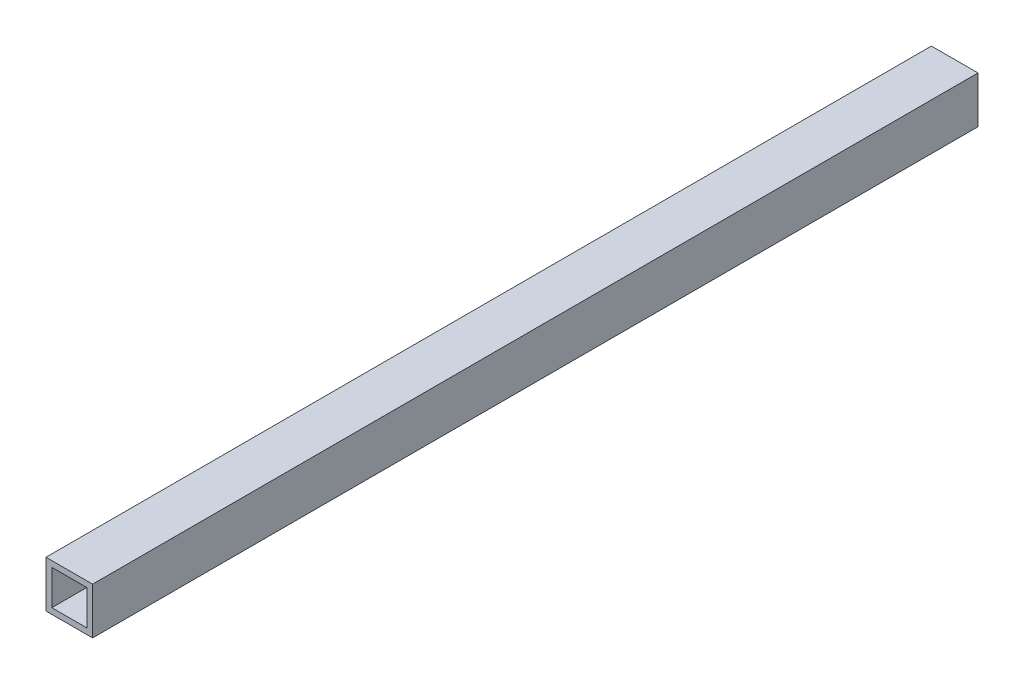
ISO-10303-21;
HEADER;
FILE_DESCRIPTION(('STEP AP214'),'2;1');
FILE_NAME('part.step','',(''),(''),'','','');
FILE_SCHEMA(('AUTOMOTIVE_DESIGN { 1 0 10303 214 1 1 1 1 }'));
ENDSEC;
DATA;
#1=APPLICATION_CONTEXT('core data for automotive mechanical design processes');
#2=APPLICATION_PROTOCOL_DEFINITION('international standard','automotive_design',2000,#1);
#3=PRODUCT_CONTEXT('',#1,'mechanical');
#4=PRODUCT('Part','Part','',(#3));
#5=PRODUCT_RELATED_PRODUCT_CATEGORY('part','',(#4));
#6=PRODUCT_DEFINITION_FORMATION('','',#4);
#7=PRODUCT_DEFINITION_CONTEXT('part definition',#1,'design');
#8=PRODUCT_DEFINITION('design','',#6,#7);
#9=PRODUCT_DEFINITION_SHAPE('','',#8);
#10=(LENGTH_UNIT() NAMED_UNIT(*) SI_UNIT(.MILLI.,.METRE.));
#11=(NAMED_UNIT(*) PLANE_ANGLE_UNIT() SI_UNIT($,.RADIAN.));
#12=(NAMED_UNIT(*) SI_UNIT($,.STERADIAN.) SOLID_ANGLE_UNIT());
#13=UNCERTAINTY_MEASURE_WITH_UNIT(LENGTH_MEASURE(1.E-05),#10,'distance_accuracy_value','');
#14=(GEOMETRIC_REPRESENTATION_CONTEXT(3) GLOBAL_UNCERTAINTY_ASSIGNED_CONTEXT((#13)) GLOBAL_UNIT_ASSIGNED_CONTEXT((#10,
#11,#12)) REPRESENTATION_CONTEXT('',''));
#15=CARTESIAN_POINT('',(0.,0.,0.));
#16=DIRECTION('',(0.,0.,1.));
#17=DIRECTION('',(1.,0.,0.));
#18=AXIS2_PLACEMENT_3D('',#15,#16,#17);
#19=CARTESIAN_POINT('',(0.,0.,482.6));
#20=DIRECTION('',(0.,0.,-1.));
#21=DIRECTION('',(-1.,0.,0.));
#22=AXIS2_PLACEMENT_3D('',#19,#20,#21);
#23=PLANE('',#22);
#24=DIRECTION('',(0.,-1.,0.));
#25=VECTOR('',#24,1.);
#26=CARTESIAN_POINT('',(0.,0.,482.6));
#27=LINE('',#26,#25);
#28=CARTESIAN_POINT('',(0.,25.4,482.6));
#29=VERTEX_POINT('',#28);
#30=CARTESIAN_POINT('',(0.,0.,482.6));
#31=VERTEX_POINT('',#30);
#32=EDGE_CURVE('E153',#29,#31,#27,.T.);
#33=ORIENTED_EDGE('',*,*,#32,.T.);
#34=DIRECTION('',(1.,0.,0.));
#35=VECTOR('',#34,1.);
#36=CARTESIAN_POINT('',(0.,0.,482.6));
#37=LINE('',#36,#35);
#38=CARTESIAN_POINT('',(25.4,0.,482.6));
#39=VERTEX_POINT('',#38);
#40=EDGE_CURVE('E157',#31,#39,#37,.T.);
#41=ORIENTED_EDGE('',*,*,#40,.T.);
#42=DIRECTION('',(0.,1.,0.));
#43=VECTOR('',#42,1.);
#44=CARTESIAN_POINT('',(25.4,0.,482.6));
#45=LINE('',#44,#43);
#46=CARTESIAN_POINT('',(25.4,25.4,482.6));
#47=VERTEX_POINT('',#46);
#48=EDGE_CURVE('E161',#39,#47,#45,.T.);
#49=ORIENTED_EDGE('',*,*,#48,.T.);
#50=DIRECTION('',(-1.,0.,0.));
#51=VECTOR('',#50,1.);
#52=CARTESIAN_POINT('',(0.,25.4,482.6));
#53=LINE('',#52,#51);
#54=EDGE_CURVE('E164',#47,#29,#53,.T.);
#55=ORIENTED_EDGE('',*,*,#54,.T.);
#56=EDGE_LOOP('',(#33,#41,#49,#55));
#57=FACE_BOUND('',#56,.T.);
#58=DIRECTION('',(0.,-1.,0.));
#59=VECTOR('',#58,1.);
#60=CARTESIAN_POINT('',(3.175,22.225,482.6));
#61=LINE('',#60,#59);
#62=CARTESIAN_POINT('',(3.175,22.225,482.6));
#63=VERTEX_POINT('',#62);
#64=CARTESIAN_POINT('',(3.17500000000001,3.17499999999999,482.6));
#65=VERTEX_POINT('',#64);
#66=EDGE_CURVE('E105',#63,#65,#61,.T.);
#67=ORIENTED_EDGE('',*,*,#66,.F.);
#68=DIRECTION('',(-1.,0.,0.));
#69=VECTOR('',#68,1.);
#70=CARTESIAN_POINT('',(3.175,22.225,482.6));
#71=LINE('',#70,#69);
#72=CARTESIAN_POINT('',(22.225,22.225,482.6));
#73=VERTEX_POINT('',#72);
#74=EDGE_CURVE('E131',#73,#63,#71,.T.);
#75=ORIENTED_EDGE('',*,*,#74,.F.);
#76=DIRECTION('',(0.,1.,0.));
#77=VECTOR('',#76,1.);
#78=CARTESIAN_POINT('',(22.225,22.225,482.6));
#79=LINE('',#78,#77);
#80=CARTESIAN_POINT('',(22.225,3.17499999999999,482.6));
#81=VERTEX_POINT('',#80);
#82=EDGE_CURVE('E127',#81,#73,#79,.T.);
#83=ORIENTED_EDGE('',*,*,#82,.F.);
#84=DIRECTION('',(1.,0.,0.));
#85=VECTOR('',#84,1.);
#86=CARTESIAN_POINT('',(3.17500000000001,3.17499999999999,482.6));
#87=LINE('',#86,#85);
#88=EDGE_CURVE('E114',#65,#81,#87,.T.);
#89=ORIENTED_EDGE('',*,*,#88,.F.);
#90=EDGE_LOOP('',(#67,#75,#83,#89));
#91=FACE_BOUND('',#90,.T.);
#92=ADVANCED_FACE('F39',(#57,#91),#23,.F.);
#93=CARTESIAN_POINT('',(0.,0.,0.));
#94=DIRECTION('',(0.,0.,-1.));
#95=DIRECTION('',(-1.,0.,0.));
#96=AXIS2_PLACEMENT_3D('',#93,#94,#95);
#97=PLANE('',#96);
#98=DIRECTION('',(0.,-1.,0.));
#99=VECTOR('',#98,1.);
#100=CARTESIAN_POINT('',(0.,0.,0.));
#101=LINE('',#100,#99);
#102=CARTESIAN_POINT('',(0.,25.4,0.));
#103=VERTEX_POINT('',#102);
#104=CARTESIAN_POINT('',(0.,0.,0.));
#105=VERTEX_POINT('',#104);
#106=EDGE_CURVE('E123',#103,#105,#101,.T.);
#107=ORIENTED_EDGE('',*,*,#106,.F.);
#108=DIRECTION('',(-1.,0.,0.));
#109=VECTOR('',#108,1.);
#110=CARTESIAN_POINT('',(0.,25.4,0.));
#111=LINE('',#110,#109);
#112=CARTESIAN_POINT('',(25.4,25.4,0.));
#113=VERTEX_POINT('',#112);
#114=EDGE_CURVE('E158',#113,#103,#111,.T.);
#115=ORIENTED_EDGE('',*,*,#114,.F.);
#116=DIRECTION('',(0.,1.,0.));
#117=VECTOR('',#116,1.);
#118=CARTESIAN_POINT('',(25.4,0.,0.));
#119=LINE('',#118,#117);
#120=CARTESIAN_POINT('',(25.4,0.,0.));
#121=VERTEX_POINT('',#120);
#122=EDGE_CURVE('E174',#121,#113,#119,.T.);
#123=ORIENTED_EDGE('',*,*,#122,.F.);
#124=DIRECTION('',(1.,0.,0.));
#125=VECTOR('',#124,1.);
#126=CARTESIAN_POINT('',(0.,0.,0.));
#127=LINE('',#126,#125);
#128=EDGE_CURVE('E171',#105,#121,#127,.T.);
#129=ORIENTED_EDGE('',*,*,#128,.F.);
#130=EDGE_LOOP('',(#107,#115,#123,#129));
#131=FACE_BOUND('',#130,.T.);
#132=DIRECTION('',(-1.,0.,0.));
#133=VECTOR('',#132,1.);
#134=CARTESIAN_POINT('',(3.175,22.225,0.));
#135=LINE('',#134,#133);
#136=CARTESIAN_POINT('',(22.225,22.225,0.));
#137=VERTEX_POINT('',#136);
#138=CARTESIAN_POINT('',(3.175,22.225,0.));
#139=VERTEX_POINT('',#138);
#140=EDGE_CURVE('E115',#137,#139,#135,.T.);
#141=ORIENTED_EDGE('',*,*,#140,.T.);
#142=DIRECTION('',(0.,-1.,0.));
#143=VECTOR('',#142,1.);
#144=CARTESIAN_POINT('',(3.175,22.225,0.));
#145=LINE('',#144,#143);
#146=CARTESIAN_POINT('',(3.17500000000001,3.17499999999999,0.));
#147=VERTEX_POINT('',#146);
#148=EDGE_CURVE('E63',#139,#147,#145,.T.);
#149=ORIENTED_EDGE('',*,*,#148,.T.);
#150=DIRECTION('',(1.,0.,0.));
#151=VECTOR('',#150,1.);
#152=CARTESIAN_POINT('',(3.17500000000001,3.17499999999999,0.));
#153=LINE('',#152,#151);
#154=CARTESIAN_POINT('',(22.225,3.17499999999999,0.));
#155=VERTEX_POINT('',#154);
#156=EDGE_CURVE('E121',#147,#155,#153,.T.);
#157=ORIENTED_EDGE('',*,*,#156,.T.);
#158=DIRECTION('',(0.,1.,0.));
#159=VECTOR('',#158,1.);
#160=CARTESIAN_POINT('',(22.225,22.225,0.));
#161=LINE('',#160,#159);
#162=EDGE_CURVE('E140',#155,#137,#161,.T.);
#163=ORIENTED_EDGE('',*,*,#162,.T.);
#164=EDGE_LOOP('',(#141,#149,#157,#163));
#165=FACE_BOUND('',#164,.T.);
#166=ADVANCED_FACE('F197',(#131,#165),#97,.T.);
#167=CARTESIAN_POINT('',(0.,0.,482.6));
#168=DIRECTION('',(1.,0.,0.));
#169=DIRECTION('',(0.,1.,0.));
#170=AXIS2_PLACEMENT_3D('',#167,#168,#169);
#171=PLANE('',#170);
#172=ORIENTED_EDGE('',*,*,#106,.T.);
#173=DIRECTION('',(0.,0.,-1.));
#174=VECTOR('',#173,1.);
#175=CARTESIAN_POINT('',(0.,0.,482.6));
#176=LINE('',#175,#174);
#177=EDGE_CURVE('E11',#31,#105,#176,.T.);
#178=ORIENTED_EDGE('',*,*,#177,.F.);
#179=ORIENTED_EDGE('',*,*,#32,.F.);
#180=DIRECTION('',(0.,0.,-1.));
#181=VECTOR('',#180,1.);
#182=CARTESIAN_POINT('',(0.,25.4,482.6));
#183=LINE('',#182,#181);
#184=EDGE_CURVE('E167',#29,#103,#183,.T.);
#185=ORIENTED_EDGE('',*,*,#184,.T.);
#186=EDGE_LOOP('',(#172,#178,#179,#185));
#187=FACE_BOUND('',#186,.T.);
#188=ADVANCED_FACE('F41',(#187),#171,.F.);
#189=CARTESIAN_POINT('',(0.,0.,482.6));
#190=DIRECTION('',(0.,1.,0.));
#191=DIRECTION('',(0.,0.,1.));
#192=AXIS2_PLACEMENT_3D('',#189,#190,#191);
#193=PLANE('',#192);
#194=ORIENTED_EDGE('',*,*,#128,.T.);
#195=DIRECTION('',(0.,0.,-1.));
#196=VECTOR('',#195,1.);
#197=CARTESIAN_POINT('',(25.4,0.,482.6));
#198=LINE('',#197,#196);
#199=EDGE_CURVE('E48',#39,#121,#198,.T.);
#200=ORIENTED_EDGE('',*,*,#199,.F.);
#201=ORIENTED_EDGE('',*,*,#40,.F.);
#202=ORIENTED_EDGE('',*,*,#177,.T.);
#203=EDGE_LOOP('',(#194,#200,#201,#202));
#204=FACE_BOUND('',#203,.T.);
#205=ADVANCED_FACE('F207',(#204),#193,.F.);
#206=CARTESIAN_POINT('',(25.4,0.,482.6));
#207=DIRECTION('',(-1.,0.,0.));
#208=DIRECTION('',(0.,-1.,0.));
#209=AXIS2_PLACEMENT_3D('',#206,#207,#208);
#210=PLANE('',#209);
#211=ORIENTED_EDGE('',*,*,#122,.T.);
#212=DIRECTION('',(0.,0.,-1.));
#213=VECTOR('',#212,1.);
#214=CARTESIAN_POINT('',(25.4,25.4,482.6));
#215=LINE('',#214,#213);
#216=EDGE_CURVE('E182',#47,#113,#215,.T.);
#217=ORIENTED_EDGE('',*,*,#216,.F.);
#218=ORIENTED_EDGE('',*,*,#48,.F.);
#219=ORIENTED_EDGE('',*,*,#199,.T.);
#220=EDGE_LOOP('',(#211,#217,#218,#219));
#221=FACE_BOUND('',#220,.T.);
#222=ADVANCED_FACE('F191',(#221),#210,.F.);
#223=CARTESIAN_POINT('',(0.,25.4,482.6));
#224=DIRECTION('',(0.,-1.,0.));
#225=DIRECTION('',(0.,0.,-1.));
#226=AXIS2_PLACEMENT_3D('',#223,#224,#225);
#227=PLANE('',#226);
#228=ORIENTED_EDGE('',*,*,#114,.T.);
#229=ORIENTED_EDGE('',*,*,#184,.F.);
#230=ORIENTED_EDGE('',*,*,#54,.F.);
#231=ORIENTED_EDGE('',*,*,#216,.T.);
#232=EDGE_LOOP('',(#228,#229,#230,#231));
#233=FACE_BOUND('',#232,.T.);
#234=ADVANCED_FACE('F201',(#233),#227,.F.);
#235=CARTESIAN_POINT('',(3.175,22.225,482.6));
#236=DIRECTION('',(1.,0.,0.));
#237=DIRECTION('',(0.,1.,0.));
#238=AXIS2_PLACEMENT_3D('',#235,#236,#237);
#239=PLANE('',#238);
#240=ORIENTED_EDGE('',*,*,#148,.F.);
#241=DIRECTION('',(0.,0.,-1.));
#242=VECTOR('',#241,1.);
#243=CARTESIAN_POINT('',(3.175,22.225,482.6));
#244=LINE('',#243,#242);
#245=EDGE_CURVE('E109',#63,#139,#244,.T.);
#246=ORIENTED_EDGE('',*,*,#245,.F.);
#247=ORIENTED_EDGE('',*,*,#66,.T.);
#248=DIRECTION('',(0.,0.,-1.));
#249=VECTOR('',#248,1.);
#250=CARTESIAN_POINT('',(3.17500000000001,3.17499999999999,482.6));
#251=LINE('',#250,#249);
#252=EDGE_CURVE('E108',#65,#147,#251,.T.);
#253=ORIENTED_EDGE('',*,*,#252,.T.);
#254=EDGE_LOOP('',(#240,#246,#247,#253));
#255=FACE_BOUND('',#254,.T.);
#256=ADVANCED_FACE('F107',(#255),#239,.T.);
#257=CARTESIAN_POINT('',(3.17500000000001,3.17499999999999,482.6));
#258=DIRECTION('',(0.,1.,0.));
#259=DIRECTION('',(-1.,0.,0.));
#260=AXIS2_PLACEMENT_3D('',#257,#258,#259);
#261=PLANE('',#260);
#262=ORIENTED_EDGE('',*,*,#156,.F.);
#263=ORIENTED_EDGE('',*,*,#252,.F.);
#264=ORIENTED_EDGE('',*,*,#88,.T.);
#265=DIRECTION('',(0.,0.,-1.));
#266=VECTOR('',#265,1.);
#267=CARTESIAN_POINT('',(22.225,3.17499999999999,482.6));
#268=LINE('',#267,#266);
#269=EDGE_CURVE('E124',#81,#155,#268,.T.);
#270=ORIENTED_EDGE('',*,*,#269,.T.);
#271=EDGE_LOOP('',(#262,#263,#264,#270));
#272=FACE_BOUND('',#271,.T.);
#273=ADVANCED_FACE('F118',(#272),#261,.T.);
#274=CARTESIAN_POINT('',(22.225,22.225,482.6));
#275=DIRECTION('',(-1.,0.,0.));
#276=DIRECTION('',(0.,-1.,0.));
#277=AXIS2_PLACEMENT_3D('',#274,#275,#276);
#278=PLANE('',#277);
#279=ORIENTED_EDGE('',*,*,#162,.F.);
#280=ORIENTED_EDGE('',*,*,#269,.F.);
#281=ORIENTED_EDGE('',*,*,#82,.T.);
#282=DIRECTION('',(0.,0.,-1.));
#283=VECTOR('',#282,1.);
#284=CARTESIAN_POINT('',(22.225,22.225,482.6));
#285=LINE('',#284,#283);
#286=EDGE_CURVE('E55',#73,#137,#285,.T.);
#287=ORIENTED_EDGE('',*,*,#286,.T.);
#288=EDGE_LOOP('',(#279,#280,#281,#287));
#289=FACE_BOUND('',#288,.T.);
#290=ADVANCED_FACE('F230',(#289),#278,.T.);
#291=CARTESIAN_POINT('',(3.175,22.225,482.6));
#292=DIRECTION('',(0.,-1.,0.));
#293=DIRECTION('',(0.,0.,-1.));
#294=AXIS2_PLACEMENT_3D('',#291,#292,#293);
#295=PLANE('',#294);
#296=ORIENTED_EDGE('',*,*,#140,.F.);
#297=ORIENTED_EDGE('',*,*,#286,.F.);
#298=ORIENTED_EDGE('',*,*,#74,.T.);
#299=ORIENTED_EDGE('',*,*,#245,.T.);
#300=EDGE_LOOP('',(#296,#297,#298,#299));
#301=FACE_BOUND('',#300,.T.);
#302=ADVANCED_FACE('F234',(#301),#295,.T.);
#303=CLOSED_SHELL('',(#92,#166,#188,#205,#222,#234,#256,#273,#290,#302));
#304=MANIFOLD_SOLID_BREP('B2',#303);
#305=ADVANCED_BREP_SHAPE_REPRESENTATION('',(#18,#304),#14);
#306=SHAPE_DEFINITION_REPRESENTATION(#9,#305);
ENDSEC;
END-ISO-10303-21;
